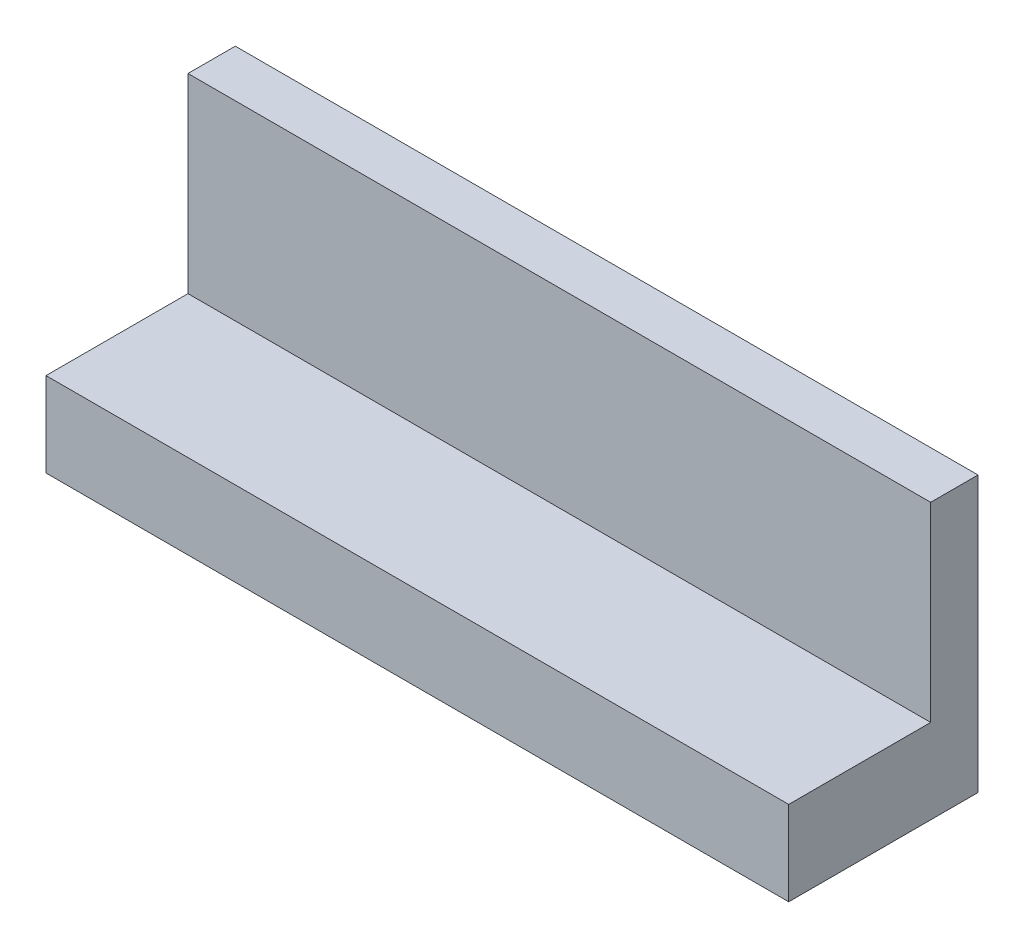
ISO-10303-21;
HEADER;
FILE_DESCRIPTION(('STEP AP214'),'2;1');
FILE_NAME('part.step','',(''),(''),'','','');
FILE_SCHEMA(('AUTOMOTIVE_DESIGN { 1 0 10303 214 1 1 1 1 }'));
ENDSEC;
DATA;
#1=APPLICATION_CONTEXT('core data for automotive mechanical design processes');
#2=APPLICATION_PROTOCOL_DEFINITION('international standard','automotive_design',2000,#1);
#3=PRODUCT_CONTEXT('',#1,'mechanical');
#4=PRODUCT('Part','Part','',(#3));
#5=PRODUCT_RELATED_PRODUCT_CATEGORY('part','',(#4));
#6=PRODUCT_DEFINITION_FORMATION('','',#4);
#7=PRODUCT_DEFINITION_CONTEXT('part definition',#1,'design');
#8=PRODUCT_DEFINITION('design','',#6,#7);
#9=PRODUCT_DEFINITION_SHAPE('','',#8);
#10=(LENGTH_UNIT() NAMED_UNIT(*) SI_UNIT(.MILLI.,.METRE.));
#11=(NAMED_UNIT(*) PLANE_ANGLE_UNIT() SI_UNIT($,.RADIAN.));
#12=(NAMED_UNIT(*) SI_UNIT($,.STERADIAN.) SOLID_ANGLE_UNIT());
#13=UNCERTAINTY_MEASURE_WITH_UNIT(LENGTH_MEASURE(1.E-05),#10,'distance_accuracy_value','');
#14=(GEOMETRIC_REPRESENTATION_CONTEXT(3) GLOBAL_UNCERTAINTY_ASSIGNED_CONTEXT((#13)) GLOBAL_UNIT_ASSIGNED_CONTEXT((#10,
#11,#12)) REPRESENTATION_CONTEXT('',''));
#15=CARTESIAN_POINT('',(0.,0.,0.));
#16=DIRECTION('',(0.,0.,1.));
#17=DIRECTION('',(1.,0.,0.));
#18=AXIS2_PLACEMENT_3D('',#15,#16,#17);
#19=CARTESIAN_POINT('',(0.,0.,5.));
#20=DIRECTION('',(0.,0.,-1.));
#21=DIRECTION('',(-1.,0.,0.));
#22=AXIS2_PLACEMENT_3D('',#19,#20,#21);
#23=PLANE('',#22);
#24=DIRECTION('',(-1.,0.,0.));
#25=VECTOR('',#24,1.);
#26=CARTESIAN_POINT('',(-78.4734820144443,-11.2269117361768,5.));
#27=LINE('',#26,#25);
#28=CARTESIAN_POINT('',(78.4734820144443,-11.2269117361768,5.));
#29=VERTEX_POINT('',#28);
#30=CARTESIAN_POINT('',(-78.4734820144443,-11.2269117361768,5.));
#31=VERTEX_POINT('',#30);
#32=EDGE_CURVE('E56',#29,#31,#27,.T.);
#33=ORIENTED_EDGE('',*,*,#32,.F.);
#34=DIRECTION('',(0.,1.,0.));
#35=VECTOR('',#34,1.);
#36=CARTESIAN_POINT('',(78.4734820144443,-29.0592928278744,5.));
#37=LINE('',#36,#35);
#38=CARTESIAN_POINT('',(78.4734820144443,29.0592928278744,5.));
#39=VERTEX_POINT('',#38);
#40=EDGE_CURVE('E93',#29,#39,#37,.T.);
#41=ORIENTED_EDGE('',*,*,#40,.T.);
#42=DIRECTION('',(-1.,0.,0.));
#43=VECTOR('',#42,1.);
#44=CARTESIAN_POINT('',(-78.4734820144443,29.0592928278744,5.));
#45=LINE('',#44,#43);
#46=CARTESIAN_POINT('',(-78.4734820144443,29.0592928278744,5.));
#47=VERTEX_POINT('',#46);
#48=EDGE_CURVE('E62',#39,#47,#45,.T.);
#49=ORIENTED_EDGE('',*,*,#48,.T.);
#50=DIRECTION('',(0.,-1.,0.));
#51=VECTOR('',#50,1.);
#52=CARTESIAN_POINT('',(-78.4734820144443,-29.0592928278744,5.));
#53=LINE('',#52,#51);
#54=EDGE_CURVE('E104',#47,#31,#53,.T.);
#55=ORIENTED_EDGE('',*,*,#54,.T.);
#56=EDGE_LOOP('',(#33,#41,#49,#55));
#57=FACE_BOUND('',#56,.T.);
#58=ADVANCED_FACE('F41',(#57),#23,.F.);
#59=CARTESIAN_POINT('',(78.4734820144443,-29.0592928278744,5.));
#60=DIRECTION('',(-1.,0.,0.));
#61=DIRECTION('',(0.,0.,1.));
#62=AXIS2_PLACEMENT_3D('',#59,#60,#61);
#63=PLANE('',#62);
#64=DIRECTION('',(0.,1.,0.));
#65=VECTOR('',#64,1.);
#66=CARTESIAN_POINT('',(78.4734820144443,-29.0592928278744,-5.));
#67=LINE('',#66,#65);
#68=CARTESIAN_POINT('',(78.4734820144443,-29.0592928278744,-5.));
#69=VERTEX_POINT('',#68);
#70=CARTESIAN_POINT('',(78.4734820144443,29.0592928278744,-5.));
#71=VERTEX_POINT('',#70);
#72=EDGE_CURVE('E100',#69,#71,#67,.T.);
#73=ORIENTED_EDGE('',*,*,#72,.T.);
#74=DIRECTION('',(0.,0.,-1.));
#75=VECTOR('',#74,1.);
#76=CARTESIAN_POINT('',(78.4734820144443,29.0592928278744,5.));
#77=LINE('',#76,#75);
#78=EDGE_CURVE('E11',#39,#71,#77,.T.);
#79=ORIENTED_EDGE('',*,*,#78,.F.);
#80=ORIENTED_EDGE('',*,*,#40,.F.);
#81=DIRECTION('',(0.,0.,-1.));
#82=VECTOR('',#81,1.);
#83=CARTESIAN_POINT('',(78.4734820144443,-11.2269117361768,35.));
#84=LINE('',#83,#82);
#85=CARTESIAN_POINT('',(78.4734820144443,-11.2269117361768,35.));
#86=VERTEX_POINT('',#85);
#87=EDGE_CURVE('E108',#86,#29,#84,.T.);
#88=ORIENTED_EDGE('',*,*,#87,.F.);
#89=DIRECTION('',(0.,1.,0.));
#90=VECTOR('',#89,1.);
#91=CARTESIAN_POINT('',(78.4734820144443,-11.2269117361768,35.));
#92=LINE('',#91,#90);
#93=CARTESIAN_POINT('',(78.4734820144443,-29.0592928278744,35.));
#94=VERTEX_POINT('',#93);
#95=EDGE_CURVE('E103',#94,#86,#92,.T.);
#96=ORIENTED_EDGE('',*,*,#95,.F.);
#97=DIRECTION('',(0.,0.,-1.));
#98=VECTOR('',#97,1.);
#99=CARTESIAN_POINT('',(78.4734820144443,-29.0592928278744,5.));
#100=LINE('',#99,#98);
#101=EDGE_CURVE('E86',#94,#69,#100,.T.);
#102=ORIENTED_EDGE('',*,*,#101,.T.);
#103=EDGE_LOOP('',(#73,#79,#80,#88,#96,#102));
#104=FACE_BOUND('',#103,.T.);
#105=ADVANCED_FACE('F43',(#104),#63,.F.);
#106=CARTESIAN_POINT('',(-78.4734820144443,29.0592928278744,5.));
#107=DIRECTION('',(0.,-1.,0.));
#108=DIRECTION('',(0.,0.,-1.));
#109=AXIS2_PLACEMENT_3D('',#106,#107,#108);
#110=PLANE('',#109);
#111=DIRECTION('',(-1.,0.,0.));
#112=VECTOR('',#111,1.);
#113=CARTESIAN_POINT('',(-78.4734820144443,29.0592928278744,-5.));
#114=LINE('',#113,#112);
#115=CARTESIAN_POINT('',(-78.4734820144443,29.0592928278744,-5.));
#116=VERTEX_POINT('',#115);
#117=EDGE_CURVE('E107',#71,#116,#114,.T.);
#118=ORIENTED_EDGE('',*,*,#117,.T.);
#119=DIRECTION('',(0.,0.,-1.));
#120=VECTOR('',#119,1.);
#121=CARTESIAN_POINT('',(-78.4734820144443,29.0592928278744,5.));
#122=LINE('',#121,#120);
#123=EDGE_CURVE('E49',#47,#116,#122,.T.);
#124=ORIENTED_EDGE('',*,*,#123,.F.);
#125=ORIENTED_EDGE('',*,*,#48,.F.);
#126=ORIENTED_EDGE('',*,*,#78,.T.);
#127=EDGE_LOOP('',(#118,#124,#125,#126));
#128=FACE_BOUND('',#127,.T.);
#129=ADVANCED_FACE('F124',(#128),#110,.F.);
#130=CARTESIAN_POINT('',(-78.4734820144443,-29.0592928278744,5.));
#131=DIRECTION('',(1.,0.,0.));
#132=DIRECTION('',(0.,0.,-1.));
#133=AXIS2_PLACEMENT_3D('',#130,#131,#132);
#134=PLANE('',#133);
#135=DIRECTION('',(0.,-1.,0.));
#136=VECTOR('',#135,1.);
#137=CARTESIAN_POINT('',(-78.4734820144443,-29.0592928278744,-5.));
#138=LINE('',#137,#136);
#139=CARTESIAN_POINT('',(-78.4734820144443,-29.0592928278744,-5.));
#140=VERTEX_POINT('',#139);
#141=EDGE_CURVE('E94',#116,#140,#138,.T.);
#142=ORIENTED_EDGE('',*,*,#141,.T.);
#143=DIRECTION('',(0.,0.,-1.));
#144=VECTOR('',#143,1.);
#145=CARTESIAN_POINT('',(-78.4734820144443,-29.0592928278744,5.));
#146=LINE('',#145,#144);
#147=CARTESIAN_POINT('',(-78.4734820144443,-29.0592928278744,35.));
#148=VERTEX_POINT('',#147);
#149=EDGE_CURVE('E89',#148,#140,#146,.T.);
#150=ORIENTED_EDGE('',*,*,#149,.F.);
#151=DIRECTION('',(0.,-1.,0.));
#152=VECTOR('',#151,1.);
#153=CARTESIAN_POINT('',(-78.4734820144443,-11.2269117361768,35.));
#154=LINE('',#153,#152);
#155=CARTESIAN_POINT('',(-78.4734820144443,-11.2269117361768,35.));
#156=VERTEX_POINT('',#155);
#157=EDGE_CURVE('E139',#156,#148,#154,.T.);
#158=ORIENTED_EDGE('',*,*,#157,.F.);
#159=DIRECTION('',(0.,0.,-1.));
#160=VECTOR('',#159,1.);
#161=CARTESIAN_POINT('',(-78.4734820144443,-11.2269117361768,35.));
#162=LINE('',#161,#160);
#163=EDGE_CURVE('E112',#156,#31,#162,.T.);
#164=ORIENTED_EDGE('',*,*,#163,.T.);
#165=ORIENTED_EDGE('',*,*,#54,.F.);
#166=ORIENTED_EDGE('',*,*,#123,.T.);
#167=EDGE_LOOP('',(#142,#150,#158,#164,#165,#166));
#168=FACE_BOUND('',#167,.T.);
#169=ADVANCED_FACE('F121',(#168),#134,.F.);
#170=CARTESIAN_POINT('',(-78.4734820144443,-29.0592928278744,5.));
#171=DIRECTION('',(0.,1.,0.));
#172=DIRECTION('',(0.,0.,1.));
#173=AXIS2_PLACEMENT_3D('',#170,#171,#172);
#174=PLANE('',#173);
#175=DIRECTION('',(1.,0.,0.));
#176=VECTOR('',#175,1.);
#177=CARTESIAN_POINT('',(-78.4734820144443,-29.0592928278744,-5.));
#178=LINE('',#177,#176);
#179=EDGE_CURVE('E82',#140,#69,#178,.T.);
#180=ORIENTED_EDGE('',*,*,#179,.T.);
#181=ORIENTED_EDGE('',*,*,#101,.F.);
#182=DIRECTION('',(1.,0.,0.));
#183=VECTOR('',#182,1.);
#184=CARTESIAN_POINT('',(-78.4734820144443,-29.0592928278744,35.));
#185=LINE('',#184,#183);
#186=EDGE_CURVE('E142',#148,#94,#185,.T.);
#187=ORIENTED_EDGE('',*,*,#186,.F.);
#188=ORIENTED_EDGE('',*,*,#149,.T.);
#189=EDGE_LOOP('',(#180,#181,#187,#188));
#190=FACE_BOUND('',#189,.T.);
#191=ADVANCED_FACE('F84',(#190),#174,.F.);
#192=CARTESIAN_POINT('',(0.,0.,-5.));
#193=DIRECTION('',(0.,0.,-1.));
#194=DIRECTION('',(-1.,0.,0.));
#195=AXIS2_PLACEMENT_3D('',#192,#193,#194);
#196=PLANE('',#195);
#197=ORIENTED_EDGE('',*,*,#72,.F.);
#198=ORIENTED_EDGE('',*,*,#179,.F.);
#199=ORIENTED_EDGE('',*,*,#141,.F.);
#200=ORIENTED_EDGE('',*,*,#117,.F.);
#201=EDGE_LOOP('',(#197,#198,#199,#200));
#202=FACE_BOUND('',#201,.T.);
#203=ADVANCED_FACE('F106',(#202),#196,.T.);
#204=CARTESIAN_POINT('',(-78.4734820144443,-11.2269117361768,35.));
#205=DIRECTION('',(0.,-1.,0.));
#206=DIRECTION('',(0.,0.,-1.));
#207=AXIS2_PLACEMENT_3D('',#204,#205,#206);
#208=PLANE('',#207);
#209=ORIENTED_EDGE('',*,*,#32,.T.);
#210=ORIENTED_EDGE('',*,*,#163,.F.);
#211=DIRECTION('',(-1.,0.,0.));
#212=VECTOR('',#211,1.);
#213=CARTESIAN_POINT('',(-78.4734820144443,-11.2269117361768,35.));
#214=LINE('',#213,#212);
#215=EDGE_CURVE('E133',#86,#156,#214,.T.);
#216=ORIENTED_EDGE('',*,*,#215,.F.);
#217=ORIENTED_EDGE('',*,*,#87,.T.);
#218=EDGE_LOOP('',(#209,#210,#216,#217));
#219=FACE_BOUND('',#218,.T.);
#220=ADVANCED_FACE('F129',(#219),#208,.F.);
#221=CARTESIAN_POINT('',(0.,0.,35.));
#222=DIRECTION('',(0.,0.,1.));
#223=DIRECTION('',(1.,0.,0.));
#224=AXIS2_PLACEMENT_3D('',#221,#222,#223);
#225=PLANE('',#224);
#226=ORIENTED_EDGE('',*,*,#95,.T.);
#227=ORIENTED_EDGE('',*,*,#215,.T.);
#228=ORIENTED_EDGE('',*,*,#157,.T.);
#229=ORIENTED_EDGE('',*,*,#186,.T.);
#230=EDGE_LOOP('',(#226,#227,#228,#229));
#231=FACE_BOUND('',#230,.T.);
#232=ADVANCED_FACE('F141',(#231),#225,.T.);
#233=CLOSED_SHELL('',(#58,#105,#129,#169,#191,#203,#220,#232));
#234=MANIFOLD_SOLID_BREP('B2',#233);
#235=ADVANCED_BREP_SHAPE_REPRESENTATION('',(#18,#234),#14);
#236=SHAPE_DEFINITION_REPRESENTATION(#9,#235);
ENDSEC;
END-ISO-10303-21;
